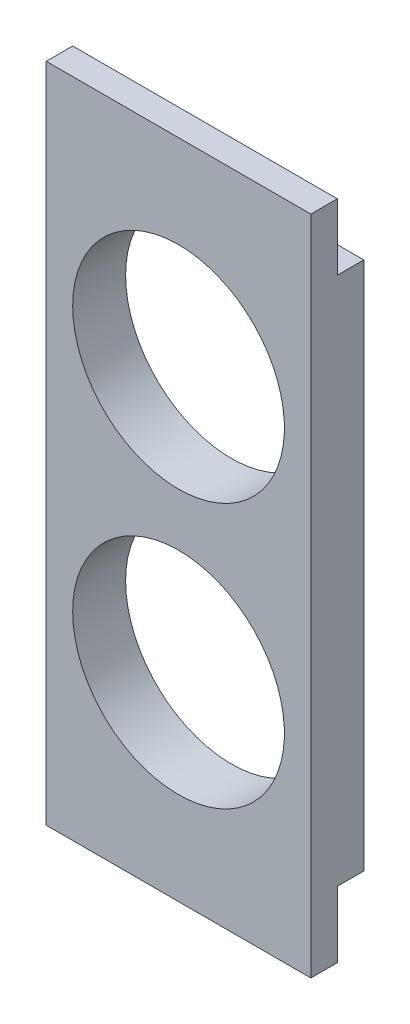
ISO-10303-21;
HEADER;
FILE_DESCRIPTION(('STEP AP214'),'2;1');
FILE_NAME('part.step','',(''),(''),'','','');
FILE_SCHEMA(('AUTOMOTIVE_DESIGN { 1 0 10303 214 1 1 1 1 }'));
ENDSEC;
DATA;
#1=APPLICATION_CONTEXT('core data for automotive mechanical design processes');
#2=APPLICATION_PROTOCOL_DEFINITION('international standard','automotive_design',2000,#1);
#3=PRODUCT_CONTEXT('',#1,'mechanical');
#4=PRODUCT('Part','Part','',(#3));
#5=PRODUCT_RELATED_PRODUCT_CATEGORY('part','',(#4));
#6=PRODUCT_DEFINITION_FORMATION('','',#4);
#7=PRODUCT_DEFINITION_CONTEXT('part definition',#1,'design');
#8=PRODUCT_DEFINITION('design','',#6,#7);
#9=PRODUCT_DEFINITION_SHAPE('','',#8);
#10=(LENGTH_UNIT() NAMED_UNIT(*) SI_UNIT(.MILLI.,.METRE.));
#11=(NAMED_UNIT(*) PLANE_ANGLE_UNIT() SI_UNIT($,.RADIAN.));
#12=(NAMED_UNIT(*) SI_UNIT($,.STERADIAN.) SOLID_ANGLE_UNIT());
#13=UNCERTAINTY_MEASURE_WITH_UNIT(LENGTH_MEASURE(1.E-05),#10,'distance_accuracy_value','');
#14=(GEOMETRIC_REPRESENTATION_CONTEXT(3) GLOBAL_UNCERTAINTY_ASSIGNED_CONTEXT((#13)) GLOBAL_UNIT_ASSIGNED_CONTEXT((#10,
#11,#12)) REPRESENTATION_CONTEXT('',''));
#15=CARTESIAN_POINT('',(0.,0.,0.));
#16=DIRECTION('',(0.,0.,1.));
#17=DIRECTION('',(1.,0.,0.));
#18=AXIS2_PLACEMENT_3D('',#15,#16,#17);
#19=CARTESIAN_POINT('',(0.,0.,0.));
#20=DIRECTION('',(0.,0.,1.));
#21=DIRECTION('',(1.,0.,0.));
#22=AXIS2_PLACEMENT_3D('',#19,#20,#21);
#23=PLANE('',#22);
#24=DIRECTION('',(0.,-1.,0.));
#25=VECTOR('',#24,1.);
#26=CARTESIAN_POINT('',(-50.,-100.,0.));
#27=LINE('',#26,#25);
#28=CARTESIAN_POINT('',(-50.,100.,0.));
#29=VERTEX_POINT('',#28);
#30=CARTESIAN_POINT('',(-50.,-100.,0.));
#31=VERTEX_POINT('',#30);
#32=EDGE_CURVE('E154',#29,#31,#27,.T.);
#33=ORIENTED_EDGE('',*,*,#32,.F.);
#34=DIRECTION('',(-1.,0.,0.));
#35=VECTOR('',#34,1.);
#36=CARTESIAN_POINT('',(50.,100.,0.));
#37=LINE('',#36,#35);
#38=CARTESIAN_POINT('',(50.,100.,0.));
#39=VERTEX_POINT('',#38);
#40=EDGE_CURVE('E78',#39,#29,#37,.T.);
#41=ORIENTED_EDGE('',*,*,#40,.F.);
#42=DIRECTION('',(0.,1.,0.));
#43=VECTOR('',#42,1.);
#44=CARTESIAN_POINT('',(50.,-100.,0.));
#45=LINE('',#44,#43);
#46=CARTESIAN_POINT('',(50.,-100.,0.));
#47=VERTEX_POINT('',#46);
#48=EDGE_CURVE('E73',#47,#39,#45,.T.);
#49=ORIENTED_EDGE('',*,*,#48,.F.);
#50=DIRECTION('',(1.,0.,0.));
#51=VECTOR('',#50,1.);
#52=CARTESIAN_POINT('',(50.,-100.,0.));
#53=LINE('',#52,#51);
#54=EDGE_CURVE('E164',#31,#47,#53,.T.);
#55=ORIENTED_EDGE('',*,*,#54,.F.);
#56=EDGE_LOOP('',(#33,#41,#49,#55));
#57=FACE_BOUND('',#56,.T.);
#58=CARTESIAN_POINT('',(0.,50.,0.));
#59=DIRECTION('',(0.,0.,1.));
#60=DIRECTION('',(1.,0.,0.));
#61=AXIS2_PLACEMENT_3D('',#58,#59,#60);
#62=CIRCLE('',#61,40.);
#63=CARTESIAN_POINT('',(40.,50.,0.));
#64=VERTEX_POINT('',#63);
#65=EDGE_CURVE('E145',#64,#64,#62,.T.);
#66=ORIENTED_EDGE('',*,*,#65,.T.);
#67=EDGE_LOOP('',(#66));
#68=FACE_BOUND('',#67,.T.);
#69=CARTESIAN_POINT('',(0.,-50.,0.));
#70=DIRECTION('',(0.,0.,1.));
#71=DIRECTION('',(-1.,0.,0.));
#72=AXIS2_PLACEMENT_3D('',#69,#70,#71);
#73=CIRCLE('',#72,40.);
#74=CARTESIAN_POINT('',(-40.,-50.,0.));
#75=VERTEX_POINT('',#74);
#76=EDGE_CURVE('E140',#75,#75,#73,.T.);
#77=ORIENTED_EDGE('',*,*,#76,.T.);
#78=EDGE_LOOP('',(#77));
#79=FACE_BOUND('',#78,.T.);
#80=ADVANCED_FACE('F39',(#57,#68,#79),#23,.F.);
#81=CARTESIAN_POINT('',(-50.,-100.,10.));
#82=DIRECTION('',(1.,0.,0.));
#83=DIRECTION('',(0.,0.,-1.));
#84=AXIS2_PLACEMENT_3D('',#81,#82,#83);
#85=PLANE('',#84);
#86=ORIENTED_EDGE('',*,*,#32,.T.);
#87=DIRECTION('',(0.,0.,-1.));
#88=VECTOR('',#87,1.);
#89=CARTESIAN_POINT('',(-50.,-100.,10.));
#90=LINE('',#89,#88);
#91=CARTESIAN_POINT('',(-50.,-100.,10.));
#92=VERTEX_POINT('',#91);
#93=EDGE_CURVE('E11',#92,#31,#90,.T.);
#94=ORIENTED_EDGE('',*,*,#93,.F.);
#95=DIRECTION('',(0.,-1.,0.));
#96=VECTOR('',#95,1.);
#97=CARTESIAN_POINT('',(-50.,-125.,10.));
#98=LINE('',#97,#96);
#99=CARTESIAN_POINT('',(-50.,-125.,10.));
#100=VERTEX_POINT('',#99);
#101=EDGE_CURVE('E137',#92,#100,#98,.T.);
#102=ORIENTED_EDGE('',*,*,#101,.T.);
#103=DIRECTION('',(0.,0.,-1.));
#104=VECTOR('',#103,1.);
#105=CARTESIAN_POINT('',(-50.,-125.,20.));
#106=LINE('',#105,#104);
#107=CARTESIAN_POINT('',(-50.,-125.,20.));
#108=VERTEX_POINT('',#107);
#109=EDGE_CURVE('E116',#108,#100,#106,.T.);
#110=ORIENTED_EDGE('',*,*,#109,.F.);
#111=DIRECTION('',(0.,-1.,0.));
#112=VECTOR('',#111,1.);
#113=CARTESIAN_POINT('',(-50.,-125.,20.));
#114=LINE('',#113,#112);
#115=CARTESIAN_POINT('',(-50.,125.,20.));
#116=VERTEX_POINT('',#115);
#117=EDGE_CURVE('E123',#116,#108,#114,.T.);
#118=ORIENTED_EDGE('',*,*,#117,.F.);
#119=DIRECTION('',(0.,0.,-1.));
#120=VECTOR('',#119,1.);
#121=CARTESIAN_POINT('',(-50.,125.,20.));
#122=LINE('',#121,#120);
#123=CARTESIAN_POINT('',(-50.,125.,10.));
#124=VERTEX_POINT('',#123);
#125=EDGE_CURVE('E203',#116,#124,#122,.T.);
#126=ORIENTED_EDGE('',*,*,#125,.T.);
#127=CARTESIAN_POINT('',(-50.,100.,10.));
#128=VERTEX_POINT('',#127);
#129=EDGE_CURVE('E184',#124,#128,#98,.T.);
#130=ORIENTED_EDGE('',*,*,#129,.T.);
#131=DIRECTION('',(0.,0.,-1.));
#132=VECTOR('',#131,1.);
#133=CARTESIAN_POINT('',(-50.,100.,10.));
#134=LINE('',#133,#132);
#135=EDGE_CURVE('E161',#128,#29,#134,.T.);
#136=ORIENTED_EDGE('',*,*,#135,.T.);
#137=EDGE_LOOP('',(#86,#94,#102,#110,#118,#126,#130,#136));
#138=FACE_BOUND('',#137,.T.);
#139=ADVANCED_FACE('F41',(#138),#85,.F.);
#140=CARTESIAN_POINT('',(50.,-100.,10.));
#141=DIRECTION('',(0.,1.,0.));
#142=DIRECTION('',(0.,0.,1.));
#143=AXIS2_PLACEMENT_3D('',#140,#141,#142);
#144=PLANE('',#143);
#145=ORIENTED_EDGE('',*,*,#54,.T.);
#146=DIRECTION('',(0.,0.,-1.));
#147=VECTOR('',#146,1.);
#148=CARTESIAN_POINT('',(50.,-100.,10.));
#149=LINE('',#148,#147);
#150=CARTESIAN_POINT('',(50.,-100.,10.));
#151=VERTEX_POINT('',#150);
#152=EDGE_CURVE('E49',#151,#47,#149,.T.);
#153=ORIENTED_EDGE('',*,*,#152,.F.);
#154=DIRECTION('',(1.,0.,0.));
#155=VECTOR('',#154,1.);
#156=CARTESIAN_POINT('',(50.,-100.,10.));
#157=LINE('',#156,#155);
#158=EDGE_CURVE('E83',#92,#151,#157,.T.);
#159=ORIENTED_EDGE('',*,*,#158,.F.);
#160=ORIENTED_EDGE('',*,*,#93,.T.);
#161=EDGE_LOOP('',(#145,#153,#159,#160));
#162=FACE_BOUND('',#161,.T.);
#163=ADVANCED_FACE('F247',(#162),#144,.F.);
#164=CARTESIAN_POINT('',(50.,-100.,10.));
#165=DIRECTION('',(-1.,0.,0.));
#166=DIRECTION('',(0.,0.,1.));
#167=AXIS2_PLACEMENT_3D('',#164,#165,#166);
#168=PLANE('',#167);
#169=ORIENTED_EDGE('',*,*,#48,.T.);
#170=DIRECTION('',(0.,0.,-1.));
#171=VECTOR('',#170,1.);
#172=CARTESIAN_POINT('',(50.,100.,10.));
#173=LINE('',#172,#171);
#174=CARTESIAN_POINT('',(50.,100.,10.));
#175=VERTEX_POINT('',#174);
#176=EDGE_CURVE('E57',#175,#39,#173,.T.);
#177=ORIENTED_EDGE('',*,*,#176,.F.);
#178=DIRECTION('',(0.,1.,0.));
#179=VECTOR('',#178,1.);
#180=CARTESIAN_POINT('',(50.,-125.,10.));
#181=LINE('',#180,#179);
#182=CARTESIAN_POINT('',(50.,125.,10.));
#183=VERTEX_POINT('',#182);
#184=EDGE_CURVE('E190',#175,#183,#181,.T.);
#185=ORIENTED_EDGE('',*,*,#184,.T.);
#186=DIRECTION('',(0.,0.,-1.));
#187=VECTOR('',#186,1.);
#188=CARTESIAN_POINT('',(50.,125.,20.));
#189=LINE('',#188,#187);
#190=CARTESIAN_POINT('',(50.,125.,20.));
#191=VERTEX_POINT('',#190);
#192=EDGE_CURVE('E147',#191,#183,#189,.T.);
#193=ORIENTED_EDGE('',*,*,#192,.F.);
#194=DIRECTION('',(0.,1.,0.));
#195=VECTOR('',#194,1.);
#196=CARTESIAN_POINT('',(50.,-125.,20.));
#197=LINE('',#196,#195);
#198=CARTESIAN_POINT('',(50.,-125.,20.));
#199=VERTEX_POINT('',#198);
#200=EDGE_CURVE('E122',#199,#191,#197,.T.);
#201=ORIENTED_EDGE('',*,*,#200,.F.);
#202=DIRECTION('',(0.,0.,-1.));
#203=VECTOR('',#202,1.);
#204=CARTESIAN_POINT('',(50.,-125.,20.));
#205=LINE('',#204,#203);
#206=CARTESIAN_POINT('',(50.,-125.,10.));
#207=VERTEX_POINT('',#206);
#208=EDGE_CURVE('E118',#199,#207,#205,.T.);
#209=ORIENTED_EDGE('',*,*,#208,.T.);
#210=EDGE_CURVE('E178',#207,#151,#181,.T.);
#211=ORIENTED_EDGE('',*,*,#210,.T.);
#212=ORIENTED_EDGE('',*,*,#152,.T.);
#213=EDGE_LOOP('',(#169,#177,#185,#193,#201,#209,#211,#212));
#214=FACE_BOUND('',#213,.T.);
#215=ADVANCED_FACE('F176',(#214),#168,.F.);
#216=CARTESIAN_POINT('',(50.,100.,10.));
#217=DIRECTION('',(0.,-1.,0.));
#218=DIRECTION('',(1.,0.,0.));
#219=AXIS2_PLACEMENT_3D('',#216,#217,#218);
#220=PLANE('',#219);
#221=ORIENTED_EDGE('',*,*,#40,.T.);
#222=ORIENTED_EDGE('',*,*,#135,.F.);
#223=DIRECTION('',(-1.,0.,0.));
#224=VECTOR('',#223,1.);
#225=CARTESIAN_POINT('',(50.,100.,10.));
#226=LINE('',#225,#224);
#227=EDGE_CURVE('E157',#175,#128,#226,.T.);
#228=ORIENTED_EDGE('',*,*,#227,.F.);
#229=ORIENTED_EDGE('',*,*,#176,.T.);
#230=EDGE_LOOP('',(#221,#222,#228,#229));
#231=FACE_BOUND('',#230,.T.);
#232=ADVANCED_FACE('F185',(#231),#220,.F.);
#233=CARTESIAN_POINT('',(0.,50.,10.));
#234=DIRECTION('',(0.,0.,-1.));
#235=DIRECTION('',(-1.,0.,0.));
#236=AXIS2_PLACEMENT_3D('',#233,#234,#235);
#237=CYLINDRICAL_SURFACE('',#236,40.);
#238=ORIENTED_EDGE('',*,*,#65,.F.);
#239=EDGE_LOOP('',(#238));
#240=FACE_BOUND('',#239,.T.);
#241=CARTESIAN_POINT('',(0.,50.,20.));
#242=DIRECTION('',(0.,0.,-1.));
#243=DIRECTION('',(-1.,0.,0.));
#244=AXIS2_PLACEMENT_3D('',#241,#242,#243);
#245=CIRCLE('',#244,40.);
#246=CARTESIAN_POINT('',(-40.,50.,20.));
#247=VERTEX_POINT('',#246);
#248=EDGE_CURVE('E214',#247,#247,#245,.T.);
#249=ORIENTED_EDGE('',*,*,#248,.F.);
#250=EDGE_LOOP('',(#249));
#251=FACE_BOUND('',#250,.T.);
#252=ADVANCED_FACE('F229',(#240,#251),#237,.F.);
#253=CARTESIAN_POINT('',(0.,-50.,10.));
#254=DIRECTION('',(0.,0.,-1.));
#255=DIRECTION('',(-1.,0.,0.));
#256=AXIS2_PLACEMENT_3D('',#253,#254,#255);
#257=CYLINDRICAL_SURFACE('',#256,40.);
#258=ORIENTED_EDGE('',*,*,#76,.F.);
#259=EDGE_LOOP('',(#258));
#260=FACE_BOUND('',#259,.T.);
#261=CARTESIAN_POINT('',(0.,-50.,20.));
#262=DIRECTION('',(0.,0.,-1.));
#263=DIRECTION('',(-1.,0.,0.));
#264=AXIS2_PLACEMENT_3D('',#261,#262,#263);
#265=CIRCLE('',#264,40.);
#266=CARTESIAN_POINT('',(-40.,-50.,20.));
#267=VERTEX_POINT('',#266);
#268=EDGE_CURVE('E217',#267,#267,#265,.T.);
#269=ORIENTED_EDGE('',*,*,#268,.F.);
#270=EDGE_LOOP('',(#269));
#271=FACE_BOUND('',#270,.T.);
#272=ADVANCED_FACE('F227',(#260,#271),#257,.F.);
#273=CARTESIAN_POINT('',(0.,0.,10.));
#274=DIRECTION('',(0.,0.,1.));
#275=DIRECTION('',(1.,0.,0.));
#276=AXIS2_PLACEMENT_3D('',#273,#274,#275);
#277=PLANE('',#276);
#278=ORIENTED_EDGE('',*,*,#184,.F.);
#279=ORIENTED_EDGE('',*,*,#227,.T.);
#280=ORIENTED_EDGE('',*,*,#129,.F.);
#281=DIRECTION('',(-1.,0.,0.));
#282=VECTOR('',#281,1.);
#283=CARTESIAN_POINT('',(50.,125.,10.));
#284=LINE('',#283,#282);
#285=EDGE_CURVE('E133',#183,#124,#284,.T.);
#286=ORIENTED_EDGE('',*,*,#285,.F.);
#287=EDGE_LOOP('',(#278,#279,#280,#286));
#288=FACE_BOUND('',#287,.T.);
#289=ADVANCED_FACE('F188',(#288),#277,.F.);
#290=CARTESIAN_POINT('',(0.,0.,20.));
#291=DIRECTION('',(0.,0.,1.));
#292=DIRECTION('',(1.,0.,0.));
#293=AXIS2_PLACEMENT_3D('',#290,#291,#292);
#294=PLANE('',#293);
#295=ORIENTED_EDGE('',*,*,#248,.T.);
#296=EDGE_LOOP('',(#295));
#297=FACE_BOUND('',#296,.T.);
#298=ORIENTED_EDGE('',*,*,#268,.T.);
#299=EDGE_LOOP('',(#298));
#300=FACE_BOUND('',#299,.T.);
#301=ORIENTED_EDGE('',*,*,#117,.T.);
#302=DIRECTION('',(1.,0.,0.));
#303=VECTOR('',#302,1.);
#304=CARTESIAN_POINT('',(50.,-125.,20.));
#305=LINE('',#304,#303);
#306=EDGE_CURVE('E112',#108,#199,#305,.T.);
#307=ORIENTED_EDGE('',*,*,#306,.T.);
#308=ORIENTED_EDGE('',*,*,#200,.T.);
#309=DIRECTION('',(-1.,0.,0.));
#310=VECTOR('',#309,1.);
#311=CARTESIAN_POINT('',(50.,125.,20.));
#312=LINE('',#311,#310);
#313=EDGE_CURVE('E128',#191,#116,#312,.T.);
#314=ORIENTED_EDGE('',*,*,#313,.T.);
#315=EDGE_LOOP('',(#301,#307,#308,#314));
#316=FACE_BOUND('',#315,.T.);
#317=ADVANCED_FACE('F126',(#297,#300,#316),#294,.T.);
#318=CARTESIAN_POINT('',(50.,125.,20.));
#319=DIRECTION('',(0.,-1.,0.));
#320=DIRECTION('',(0.,0.,-1.));
#321=AXIS2_PLACEMENT_3D('',#318,#319,#320);
#322=PLANE('',#321);
#323=ORIENTED_EDGE('',*,*,#285,.T.);
#324=ORIENTED_EDGE('',*,*,#125,.F.);
#325=ORIENTED_EDGE('',*,*,#313,.F.);
#326=ORIENTED_EDGE('',*,*,#192,.T.);
#327=EDGE_LOOP('',(#323,#324,#325,#326));
#328=FACE_BOUND('',#327,.T.);
#329=ADVANCED_FACE('F207',(#328),#322,.F.);
#330=CARTESIAN_POINT('',(50.,-125.,20.));
#331=DIRECTION('',(0.,1.,0.));
#332=DIRECTION('',(0.,0.,1.));
#333=AXIS2_PLACEMENT_3D('',#330,#331,#332);
#334=PLANE('',#333);
#335=DIRECTION('',(1.,0.,0.));
#336=VECTOR('',#335,1.);
#337=CARTESIAN_POINT('',(50.,-125.,10.));
#338=LINE('',#337,#336);
#339=EDGE_CURVE('E194',#100,#207,#338,.T.);
#340=ORIENTED_EDGE('',*,*,#339,.T.);
#341=ORIENTED_EDGE('',*,*,#208,.F.);
#342=ORIENTED_EDGE('',*,*,#306,.F.);
#343=ORIENTED_EDGE('',*,*,#109,.T.);
#344=EDGE_LOOP('',(#340,#341,#342,#343));
#345=FACE_BOUND('',#344,.T.);
#346=ADVANCED_FACE('F114',(#345),#334,.F.);
#347=ORIENTED_EDGE('',*,*,#101,.F.);
#348=ORIENTED_EDGE('',*,*,#158,.T.);
#349=ORIENTED_EDGE('',*,*,#210,.F.);
#350=ORIENTED_EDGE('',*,*,#339,.F.);
#351=EDGE_LOOP('',(#347,#348,#349,#350));
#352=FACE_BOUND('',#351,.T.);
#353=ADVANCED_FACE('F237',(#352),#277,.F.);
#354=CLOSED_SHELL('',(#80,#139,#163,#215,#232,#252,#272,#289,#317,#329,#346,#353));
#355=MANIFOLD_SOLID_BREP('B2',#354);
#356=ADVANCED_BREP_SHAPE_REPRESENTATION('',(#18,#355),#14);
#357=SHAPE_DEFINITION_REPRESENTATION(#9,#356);
ENDSEC;
END-ISO-10303-21;
